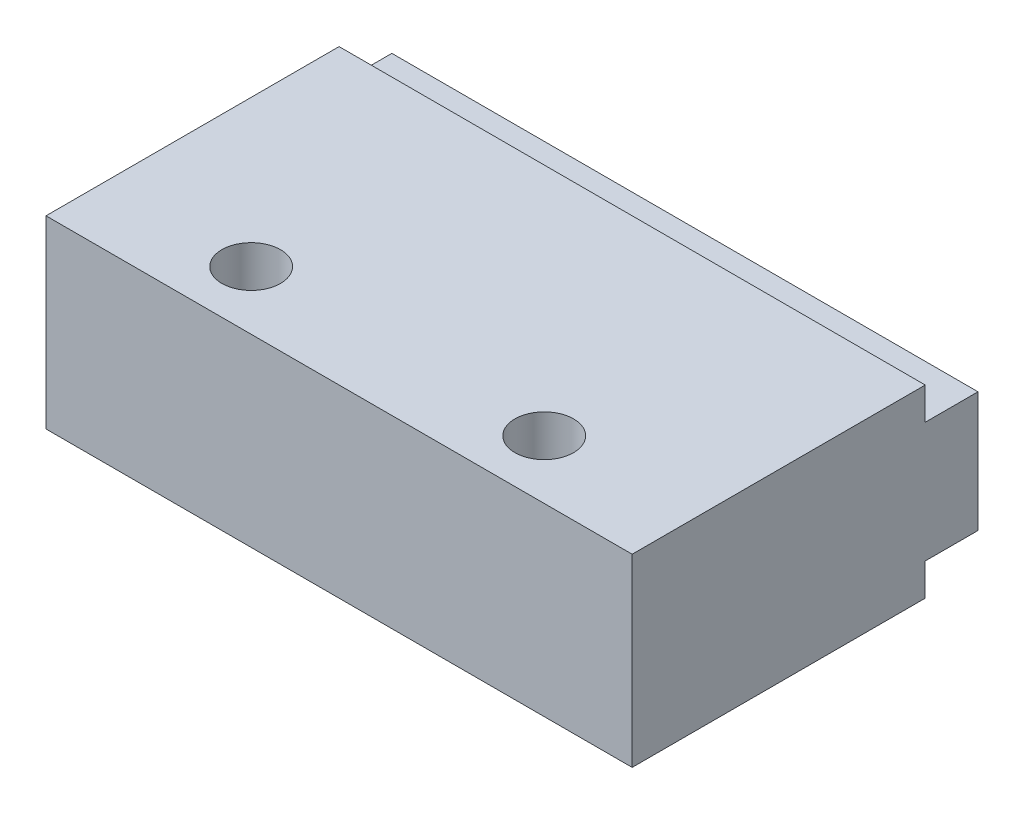
ISO-10303-21;
HEADER;
FILE_DESCRIPTION(('STEP AP214'),'2;1');
FILE_NAME('part.step','',(''),(''),'','','');
FILE_SCHEMA(('AUTOMOTIVE_DESIGN { 1 0 10303 214 1 1 1 1 }'));
ENDSEC;
DATA;
#1=APPLICATION_CONTEXT('core data for automotive mechanical design processes');
#2=APPLICATION_PROTOCOL_DEFINITION('international standard','automotive_design',2000,#1);
#3=PRODUCT_CONTEXT('',#1,'mechanical');
#4=PRODUCT('Part','Part','',(#3));
#5=PRODUCT_RELATED_PRODUCT_CATEGORY('part','',(#4));
#6=PRODUCT_DEFINITION_FORMATION('','',#4);
#7=PRODUCT_DEFINITION_CONTEXT('part definition',#1,'design');
#8=PRODUCT_DEFINITION('design','',#6,#7);
#9=PRODUCT_DEFINITION_SHAPE('','',#8);
#10=(LENGTH_UNIT() NAMED_UNIT(*) SI_UNIT(.MILLI.,.METRE.));
#11=(NAMED_UNIT(*) PLANE_ANGLE_UNIT() SI_UNIT($,.RADIAN.));
#12=(NAMED_UNIT(*) SI_UNIT($,.STERADIAN.) SOLID_ANGLE_UNIT());
#13=UNCERTAINTY_MEASURE_WITH_UNIT(LENGTH_MEASURE(1.E-05),#10,'distance_accuracy_value','');
#14=(GEOMETRIC_REPRESENTATION_CONTEXT(3) GLOBAL_UNCERTAINTY_ASSIGNED_CONTEXT((#13)) GLOBAL_UNIT_ASSIGNED_CONTEXT((#10,
#11,#12)) REPRESENTATION_CONTEXT('',''));
#15=CARTESIAN_POINT('',(0.,0.,0.));
#16=DIRECTION('',(0.,0.,1.));
#17=DIRECTION('',(1.,0.,0.));
#18=AXIS2_PLACEMENT_3D('',#15,#16,#17);
#19=CARTESIAN_POINT('',(0.,6.3,-10.));
#20=DIRECTION('',(0.,0.,1.));
#21=DIRECTION('',(1.,0.,0.));
#22=AXIS2_PLACEMENT_3D('',#19,#20,#21);
#23=PLANE('',#22);
#24=DIRECTION('',(1.,0.,0.));
#25=VECTOR('',#24,1.);
#26=CARTESIAN_POINT('',(20.,5.2,-10.));
#27=LINE('',#26,#25);
#28=CARTESIAN_POINT('',(0.,5.2,-10.));
#29=VERTEX_POINT('',#28);
#30=CARTESIAN_POINT('',(20.,5.2,-10.));
#31=VERTEX_POINT('',#30);
#32=EDGE_CURVE('E133',#29,#31,#27,.T.);
#33=ORIENTED_EDGE('',*,*,#32,.F.);
#34=DIRECTION('',(0.,-1.,0.));
#35=VECTOR('',#34,1.);
#36=CARTESIAN_POINT('',(0.,6.3,-10.));
#37=LINE('',#36,#35);
#38=CARTESIAN_POINT('',(0.,6.3,-10.));
#39=VERTEX_POINT('',#38);
#40=EDGE_CURVE('E173',#39,#29,#37,.T.);
#41=ORIENTED_EDGE('',*,*,#40,.F.);
#42=DIRECTION('',(-1.,0.,0.));
#43=VECTOR('',#42,1.);
#44=CARTESIAN_POINT('',(0.,6.3,-10.));
#45=LINE('',#44,#43);
#46=CARTESIAN_POINT('',(20.,6.3,-10.));
#47=VERTEX_POINT('',#46);
#48=EDGE_CURVE('E161',#47,#39,#45,.T.);
#49=ORIENTED_EDGE('',*,*,#48,.F.);
#50=DIRECTION('',(0.,-1.,0.));
#51=VECTOR('',#50,1.);
#52=CARTESIAN_POINT('',(20.,6.3,-10.));
#53=LINE('',#52,#51);
#54=EDGE_CURVE('E69',#47,#31,#53,.T.);
#55=ORIENTED_EDGE('',*,*,#54,.T.);
#56=EDGE_LOOP('',(#33,#41,#49,#55));
#57=FACE_BOUND('',#56,.T.);
#58=ADVANCED_FACE('F45',(#57),#23,.F.);
#59=DIRECTION('',(-1.,0.,0.));
#60=VECTOR('',#59,1.);
#61=CARTESIAN_POINT('',(20.,1.1,-10.));
#62=LINE('',#61,#60);
#63=CARTESIAN_POINT('',(20.,1.1,-10.));
#64=VERTEX_POINT('',#63);
#65=CARTESIAN_POINT('',(0.,1.1,-10.));
#66=VERTEX_POINT('',#65);
#67=EDGE_CURVE('E61',#64,#66,#62,.T.);
#68=ORIENTED_EDGE('',*,*,#67,.F.);
#69=CARTESIAN_POINT('',(20.,0.,-10.));
#70=VERTEX_POINT('',#69);
#71=EDGE_CURVE('E137',#64,#70,#53,.T.);
#72=ORIENTED_EDGE('',*,*,#71,.T.);
#73=DIRECTION('',(-1.,0.,0.));
#74=VECTOR('',#73,1.);
#75=CARTESIAN_POINT('',(0.,0.,-10.));
#76=LINE('',#75,#74);
#77=CARTESIAN_POINT('',(0.,0.,-10.));
#78=VERTEX_POINT('',#77);
#79=EDGE_CURVE('E155',#70,#78,#76,.T.);
#80=ORIENTED_EDGE('',*,*,#79,.T.);
#81=EDGE_CURVE('E163',#66,#78,#37,.T.);
#82=ORIENTED_EDGE('',*,*,#81,.F.);
#83=EDGE_LOOP('',(#68,#72,#80,#82));
#84=FACE_BOUND('',#83,.T.);
#85=ADVANCED_FACE('F188',(#84),#23,.F.);
#86=CARTESIAN_POINT('',(0.,6.3,0.));
#87=DIRECTION('',(1.,0.,0.));
#88=DIRECTION('',(0.,0.,-1.));
#89=AXIS2_PLACEMENT_3D('',#86,#87,#88);
#90=PLANE('',#89);
#91=DIRECTION('',(0.,0.,1.));
#92=VECTOR('',#91,1.);
#93=CARTESIAN_POINT('',(0.,0.,0.));
#94=LINE('',#93,#92);
#95=CARTESIAN_POINT('',(0.,0.,0.));
#96=VERTEX_POINT('',#95);
#97=EDGE_CURVE('E139',#78,#96,#94,.T.);
#98=ORIENTED_EDGE('',*,*,#97,.T.);
#99=DIRECTION('',(0.,-1.,0.));
#100=VECTOR('',#99,1.);
#101=CARTESIAN_POINT('',(0.,6.3,0.));
#102=LINE('',#101,#100);
#103=CARTESIAN_POINT('',(0.,6.3,0.));
#104=VERTEX_POINT('',#103);
#105=EDGE_CURVE('E11',#104,#96,#102,.T.);
#106=ORIENTED_EDGE('',*,*,#105,.F.);
#107=DIRECTION('',(0.,0.,1.));
#108=VECTOR('',#107,1.);
#109=CARTESIAN_POINT('',(0.,6.3,0.));
#110=LINE('',#109,#108);
#111=EDGE_CURVE('E150',#39,#104,#110,.T.);
#112=ORIENTED_EDGE('',*,*,#111,.F.);
#113=ORIENTED_EDGE('',*,*,#40,.T.);
#114=DIRECTION('',(0.,0.,1.));
#115=VECTOR('',#114,1.);
#116=CARTESIAN_POINT('',(0.,5.2,-11.8));
#117=LINE('',#116,#115);
#118=CARTESIAN_POINT('',(0.,5.2,-11.8));
#119=VERTEX_POINT('',#118);
#120=EDGE_CURVE('E146',#119,#29,#117,.T.);
#121=ORIENTED_EDGE('',*,*,#120,.F.);
#122=DIRECTION('',(0.,1.,0.));
#123=VECTOR('',#122,1.);
#124=CARTESIAN_POINT('',(0.,5.2,-11.8));
#125=LINE('',#124,#123);
#126=CARTESIAN_POINT('',(0.,1.1,-11.8));
#127=VERTEX_POINT('',#126);
#128=EDGE_CURVE('E122',#127,#119,#125,.T.);
#129=ORIENTED_EDGE('',*,*,#128,.F.);
#130=DIRECTION('',(0.,0.,1.));
#131=VECTOR('',#130,1.);
#132=CARTESIAN_POINT('',(0.,1.1,-11.8));
#133=LINE('',#132,#131);
#134=EDGE_CURVE('E118',#127,#66,#133,.T.);
#135=ORIENTED_EDGE('',*,*,#134,.T.);
#136=ORIENTED_EDGE('',*,*,#81,.T.);
#137=EDGE_LOOP('',(#98,#106,#112,#113,#121,#129,#135,#136));
#138=FACE_BOUND('',#137,.T.);
#139=ADVANCED_FACE('F47',(#138),#90,.F.);
#140=CARTESIAN_POINT('',(0.,6.3,0.));
#141=DIRECTION('',(0.,0.,-1.));
#142=DIRECTION('',(-1.,0.,0.));
#143=AXIS2_PLACEMENT_3D('',#140,#141,#142);
#144=PLANE('',#143);
#145=DIRECTION('',(1.,0.,0.));
#146=VECTOR('',#145,1.);
#147=CARTESIAN_POINT('',(0.,0.,0.));
#148=LINE('',#147,#146);
#149=CARTESIAN_POINT('',(20.,0.,0.));
#150=VERTEX_POINT('',#149);
#151=EDGE_CURVE('E144',#96,#150,#148,.T.);
#152=ORIENTED_EDGE('',*,*,#151,.T.);
#153=DIRECTION('',(0.,-1.,0.));
#154=VECTOR('',#153,1.);
#155=CARTESIAN_POINT('',(20.,6.3,0.));
#156=LINE('',#155,#154);
#157=CARTESIAN_POINT('',(20.,6.3,0.));
#158=VERTEX_POINT('',#157);
#159=EDGE_CURVE('E54',#158,#150,#156,.T.);
#160=ORIENTED_EDGE('',*,*,#159,.F.);
#161=DIRECTION('',(1.,0.,0.));
#162=VECTOR('',#161,1.);
#163=CARTESIAN_POINT('',(0.,6.3,0.));
#164=LINE('',#163,#162);
#165=EDGE_CURVE('E154',#104,#158,#164,.T.);
#166=ORIENTED_EDGE('',*,*,#165,.F.);
#167=ORIENTED_EDGE('',*,*,#105,.T.);
#168=EDGE_LOOP('',(#152,#160,#166,#167));
#169=FACE_BOUND('',#168,.T.);
#170=ADVANCED_FACE('F214',(#169),#144,.F.);
#171=CARTESIAN_POINT('',(20.,6.3,0.));
#172=DIRECTION('',(-1.,0.,0.));
#173=DIRECTION('',(0.,0.,1.));
#174=AXIS2_PLACEMENT_3D('',#171,#172,#173);
#175=PLANE('',#174);
#176=DIRECTION('',(0.,0.,-1.));
#177=VECTOR('',#176,1.);
#178=CARTESIAN_POINT('',(20.,0.,0.));
#179=LINE('',#178,#177);
#180=EDGE_CURVE('E167',#150,#70,#179,.T.);
#181=ORIENTED_EDGE('',*,*,#180,.T.);
#182=ORIENTED_EDGE('',*,*,#71,.F.);
#183=DIRECTION('',(0.,0.,1.));
#184=VECTOR('',#183,1.);
#185=CARTESIAN_POINT('',(20.,1.1,-11.8));
#186=LINE('',#185,#184);
#187=CARTESIAN_POINT('',(20.,1.1,-11.8));
#188=VERTEX_POINT('',#187);
#189=EDGE_CURVE('E116',#188,#64,#186,.T.);
#190=ORIENTED_EDGE('',*,*,#189,.F.);
#191=DIRECTION('',(0.,-1.,0.));
#192=VECTOR('',#191,1.);
#193=CARTESIAN_POINT('',(20.,5.2,-11.8));
#194=LINE('',#193,#192);
#195=CARTESIAN_POINT('',(20.,5.2,-11.8));
#196=VERTEX_POINT('',#195);
#197=EDGE_CURVE('E123',#196,#188,#194,.T.);
#198=ORIENTED_EDGE('',*,*,#197,.F.);
#199=DIRECTION('',(0.,0.,1.));
#200=VECTOR('',#199,1.);
#201=CARTESIAN_POINT('',(20.,5.2,-11.8));
#202=LINE('',#201,#200);
#203=EDGE_CURVE('E198',#196,#31,#202,.T.);
#204=ORIENTED_EDGE('',*,*,#203,.T.);
#205=ORIENTED_EDGE('',*,*,#54,.F.);
#206=DIRECTION('',(0.,0.,-1.));
#207=VECTOR('',#206,1.);
#208=CARTESIAN_POINT('',(20.,6.3,0.));
#209=LINE('',#208,#207);
#210=EDGE_CURVE('E158',#158,#47,#209,.T.);
#211=ORIENTED_EDGE('',*,*,#210,.F.);
#212=ORIENTED_EDGE('',*,*,#159,.T.);
#213=EDGE_LOOP('',(#181,#182,#190,#198,#204,#205,#211,#212));
#214=FACE_BOUND('',#213,.T.);
#215=ADVANCED_FACE('F136',(#214),#175,.F.);
#216=CARTESIAN_POINT('',(0.,6.3,0.));
#217=DIRECTION('',(0.,-1.,0.));
#218=DIRECTION('',(0.,0.,-1.));
#219=AXIS2_PLACEMENT_3D('',#216,#217,#218);
#220=PLANE('',#219);
#221=CARTESIAN_POINT('',(5.,6.3,-2.));
#222=DIRECTION('',(0.,1.,0.));
#223=DIRECTION('',(0.,0.,1.));
#224=AXIS2_PLACEMENT_3D('',#221,#222,#223);
#225=CIRCLE('',#224,1.);
#226=CARTESIAN_POINT('',(5.,6.3,-1.));
#227=VERTEX_POINT('',#226);
#228=EDGE_CURVE('E253',#227,#227,#225,.T.);
#229=ORIENTED_EDGE('',*,*,#228,.F.);
#230=EDGE_LOOP('',(#229));
#231=FACE_BOUND('',#230,.T.);
#232=CARTESIAN_POINT('',(15.,6.3,-2.));
#233=DIRECTION('',(0.,1.,0.));
#234=DIRECTION('',(0.,0.,1.));
#235=AXIS2_PLACEMENT_3D('',#232,#233,#234);
#236=CIRCLE('',#235,1.);
#237=CARTESIAN_POINT('',(15.,6.3,-1.));
#238=VERTEX_POINT('',#237);
#239=EDGE_CURVE('E255',#238,#238,#236,.T.);
#240=ORIENTED_EDGE('',*,*,#239,.F.);
#241=EDGE_LOOP('',(#240));
#242=FACE_BOUND('',#241,.T.);
#243=ORIENTED_EDGE('',*,*,#111,.T.);
#244=ORIENTED_EDGE('',*,*,#165,.T.);
#245=ORIENTED_EDGE('',*,*,#210,.T.);
#246=ORIENTED_EDGE('',*,*,#48,.T.);
#247=EDGE_LOOP('',(#243,#244,#245,#246));
#248=FACE_BOUND('',#247,.T.);
#249=ADVANCED_FACE('F213',(#231,#242,#248),#220,.F.);
#250=CARTESIAN_POINT('',(0.,0.,0.));
#251=DIRECTION('',(0.,-1.,0.));
#252=DIRECTION('',(0.,0.,-1.));
#253=AXIS2_PLACEMENT_3D('',#250,#251,#252);
#254=PLANE('',#253);
#255=CARTESIAN_POINT('',(5.,0.,-2.));
#256=DIRECTION('',(0.,1.,0.));
#257=DIRECTION('',(0.,0.,1.));
#258=AXIS2_PLACEMENT_3D('',#255,#256,#257);
#259=CIRCLE('',#258,1.);
#260=CARTESIAN_POINT('',(5.,0.,-1.));
#261=VERTEX_POINT('',#260);
#262=EDGE_CURVE('E203',#261,#261,#259,.T.);
#263=ORIENTED_EDGE('',*,*,#262,.T.);
#264=EDGE_LOOP('',(#263));
#265=FACE_BOUND('',#264,.T.);
#266=CARTESIAN_POINT('',(15.,0.,-2.));
#267=DIRECTION('',(0.,1.,0.));
#268=DIRECTION('',(0.,0.,1.));
#269=AXIS2_PLACEMENT_3D('',#266,#267,#268);
#270=CIRCLE('',#269,1.);
#271=CARTESIAN_POINT('',(15.,0.,-1.));
#272=VERTEX_POINT('',#271);
#273=EDGE_CURVE('E261',#272,#272,#270,.T.);
#274=ORIENTED_EDGE('',*,*,#273,.T.);
#275=EDGE_LOOP('',(#274));
#276=FACE_BOUND('',#275,.T.);
#277=ORIENTED_EDGE('',*,*,#97,.F.);
#278=ORIENTED_EDGE('',*,*,#79,.F.);
#279=ORIENTED_EDGE('',*,*,#180,.F.);
#280=ORIENTED_EDGE('',*,*,#151,.F.);
#281=EDGE_LOOP('',(#277,#278,#279,#280));
#282=FACE_BOUND('',#281,.T.);
#283=ADVANCED_FACE('F187',(#265,#276,#282),#254,.T.);
#284=CARTESIAN_POINT('',(20.,1.1,-11.8));
#285=DIRECTION('',(0.,1.,0.));
#286=DIRECTION('',(0.,0.,1.));
#287=AXIS2_PLACEMENT_3D('',#284,#285,#286);
#288=PLANE('',#287);
#289=ORIENTED_EDGE('',*,*,#67,.T.);
#290=ORIENTED_EDGE('',*,*,#134,.F.);
#291=DIRECTION('',(-1.,0.,0.));
#292=VECTOR('',#291,1.);
#293=CARTESIAN_POINT('',(20.,1.1,-11.8));
#294=LINE('',#293,#292);
#295=EDGE_CURVE('E112',#188,#127,#294,.T.);
#296=ORIENTED_EDGE('',*,*,#295,.F.);
#297=ORIENTED_EDGE('',*,*,#189,.T.);
#298=EDGE_LOOP('',(#289,#290,#296,#297));
#299=FACE_BOUND('',#298,.T.);
#300=ADVANCED_FACE('F114',(#299),#288,.F.);
#301=CARTESIAN_POINT('',(20.,5.2,-11.8));
#302=DIRECTION('',(0.,-1.,0.));
#303=DIRECTION('',(0.,0.,-1.));
#304=AXIS2_PLACEMENT_3D('',#301,#302,#303);
#305=PLANE('',#304);
#306=ORIENTED_EDGE('',*,*,#32,.T.);
#307=ORIENTED_EDGE('',*,*,#203,.F.);
#308=DIRECTION('',(1.,0.,0.));
#309=VECTOR('',#308,1.);
#310=CARTESIAN_POINT('',(20.,5.2,-11.8));
#311=LINE('',#310,#309);
#312=EDGE_CURVE('E128',#119,#196,#311,.T.);
#313=ORIENTED_EDGE('',*,*,#312,.F.);
#314=ORIENTED_EDGE('',*,*,#120,.T.);
#315=EDGE_LOOP('',(#306,#307,#313,#314));
#316=FACE_BOUND('',#315,.T.);
#317=ADVANCED_FACE('F209',(#316),#305,.F.);
#318=CARTESIAN_POINT('',(0.,0.,-11.8));
#319=DIRECTION('',(0.,0.,-1.));
#320=DIRECTION('',(-1.,0.,0.));
#321=AXIS2_PLACEMENT_3D('',#318,#319,#320);
#322=PLANE('',#321);
#323=ORIENTED_EDGE('',*,*,#197,.T.);
#324=ORIENTED_EDGE('',*,*,#295,.T.);
#325=ORIENTED_EDGE('',*,*,#128,.T.);
#326=ORIENTED_EDGE('',*,*,#312,.T.);
#327=EDGE_LOOP('',(#323,#324,#325,#326));
#328=FACE_BOUND('',#327,.T.);
#329=ADVANCED_FACE('F126',(#328),#322,.T.);
#330=CARTESIAN_POINT('',(15.,0.,-2.));
#331=DIRECTION('',(0.,1.,0.));
#332=DIRECTION('',(0.,0.,1.));
#333=AXIS2_PLACEMENT_3D('',#330,#331,#332);
#334=CYLINDRICAL_SURFACE('',#333,1.);
#335=ORIENTED_EDGE('',*,*,#273,.F.);
#336=EDGE_LOOP('',(#335));
#337=FACE_BOUND('',#336,.T.);
#338=ORIENTED_EDGE('',*,*,#239,.T.);
#339=EDGE_LOOP('',(#338));
#340=FACE_BOUND('',#339,.T.);
#341=ADVANCED_FACE('F239',(#337,#340),#334,.F.);
#342=CARTESIAN_POINT('',(5.,0.,-2.));
#343=DIRECTION('',(0.,1.,0.));
#344=DIRECTION('',(0.,0.,1.));
#345=AXIS2_PLACEMENT_3D('',#342,#343,#344);
#346=CYLINDRICAL_SURFACE('',#345,1.);
#347=ORIENTED_EDGE('',*,*,#262,.F.);
#348=EDGE_LOOP('',(#347));
#349=FACE_BOUND('',#348,.T.);
#350=ORIENTED_EDGE('',*,*,#228,.T.);
#351=EDGE_LOOP('',(#350));
#352=FACE_BOUND('',#351,.T.);
#353=ADVANCED_FACE('F242',(#349,#352),#346,.F.);
#354=CLOSED_SHELL('',(#58,#85,#139,#170,#215,#249,#283,#300,#317,#329,#341,#353));
#355=MANIFOLD_SOLID_BREP('B2',#354);
#356=ADVANCED_BREP_SHAPE_REPRESENTATION('',(#18,#355),#14);
#357=SHAPE_DEFINITION_REPRESENTATION(#9,#356);
ENDSEC;
END-ISO-10303-21;
